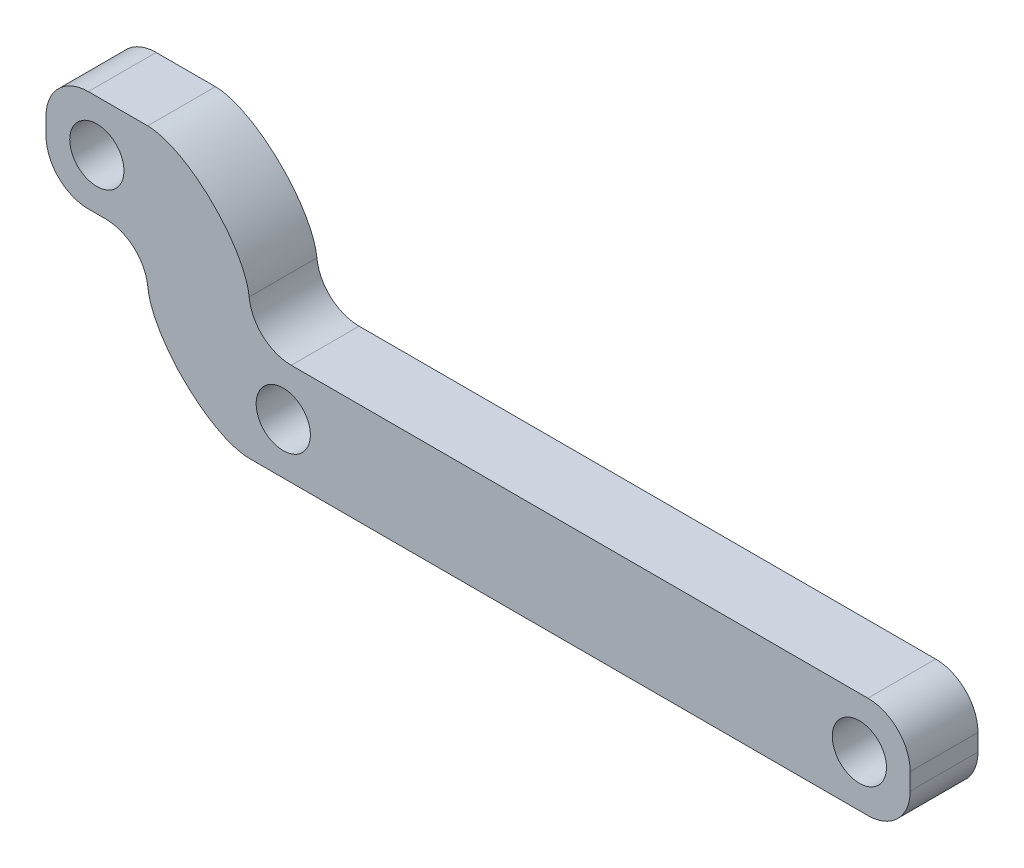
ISO-10303-21;
HEADER;
FILE_DESCRIPTION(('STEP AP214'),'2;1');
FILE_NAME('part.step','',(''),(''),'','','');
FILE_SCHEMA(('AUTOMOTIVE_DESIGN { 1 0 10303 214 1 1 1 1 }'));
ENDSEC;
DATA;
#1=APPLICATION_CONTEXT('core data for automotive mechanical design processes');
#2=APPLICATION_PROTOCOL_DEFINITION('international standard','automotive_design',2000,#1);
#3=PRODUCT_CONTEXT('',#1,'mechanical');
#4=PRODUCT('Part','Part','',(#3));
#5=PRODUCT_RELATED_PRODUCT_CATEGORY('part','',(#4));
#6=PRODUCT_DEFINITION_FORMATION('','',#4);
#7=PRODUCT_DEFINITION_CONTEXT('part definition',#1,'design');
#8=PRODUCT_DEFINITION('design','',#6,#7);
#9=PRODUCT_DEFINITION_SHAPE('','',#8);
#10=(LENGTH_UNIT() NAMED_UNIT(*) SI_UNIT(.MILLI.,.METRE.));
#11=(NAMED_UNIT(*) PLANE_ANGLE_UNIT() SI_UNIT($,.RADIAN.));
#12=(NAMED_UNIT(*) SI_UNIT($,.STERADIAN.) SOLID_ANGLE_UNIT());
#13=UNCERTAINTY_MEASURE_WITH_UNIT(LENGTH_MEASURE(1.E-05),#10,'distance_accuracy_value','');
#14=(GEOMETRIC_REPRESENTATION_CONTEXT(3) GLOBAL_UNCERTAINTY_ASSIGNED_CONTEXT((#13)) GLOBAL_UNIT_ASSIGNED_CONTEXT((#10,
#11,#12)) REPRESENTATION_CONTEXT('',''));
#15=CARTESIAN_POINT('',(0.,0.,0.));
#16=DIRECTION('',(0.,0.,1.));
#17=DIRECTION('',(1.,0.,0.));
#18=AXIS2_PLACEMENT_3D('',#15,#16,#17);
#19=CARTESIAN_POINT('',(0.,0.,4.));
#20=DIRECTION('',(0.,-1.,0.));
#21=DIRECTION('',(1.,0.,0.));
#22=AXIS2_PLACEMENT_3D('',#19,#20,#21);
#23=PLANE('',#22);
#24=DIRECTION('',(-1.,0.,0.));
#25=VECTOR('',#24,1.);
#26=CARTESIAN_POINT('',(0.,0.,0.));
#27=LINE('',#26,#25);
#28=CARTESIAN_POINT('',(-2.5,0.,0.));
#29=VERTEX_POINT('',#28);
#30=CARTESIAN_POINT('',(-36.5257940578732,0.,0.));
#31=VERTEX_POINT('',#30);
#32=EDGE_CURVE('E155',#29,#31,#27,.T.);
#33=ORIENTED_EDGE('',*,*,#32,.T.);
#34=DIRECTION('',(0.,0.,1.));
#35=VECTOR('',#34,1.);
#36=CARTESIAN_POINT('',(-36.5257940578732,0.,4.));
#37=LINE('',#36,#35);
#38=CARTESIAN_POINT('',(-36.5257940578732,0.,4.));
#39=VERTEX_POINT('',#38);
#40=EDGE_CURVE('E57',#31,#39,#37,.T.);
#41=ORIENTED_EDGE('',*,*,#40,.T.);
#42=DIRECTION('',(-1.,0.,0.));
#43=VECTOR('',#42,1.);
#44=CARTESIAN_POINT('',(0.,0.,4.));
#45=LINE('',#44,#43);
#46=CARTESIAN_POINT('',(-2.5,0.,4.));
#47=VERTEX_POINT('',#46);
#48=EDGE_CURVE('E320',#47,#39,#45,.T.);
#49=ORIENTED_EDGE('',*,*,#48,.F.);
#50=DIRECTION('',(0.,0.,-1.));
#51=VECTOR('',#50,1.);
#52=CARTESIAN_POINT('',(-2.5,0.,0.));
#53=LINE('',#52,#51);
#54=EDGE_CURVE('E323',#47,#29,#53,.T.);
#55=ORIENTED_EDGE('',*,*,#54,.T.);
#56=EDGE_LOOP('',(#33,#41,#49,#55));
#57=FACE_BOUND('',#56,.T.);
#58=ADVANCED_FACE('F41',(#57),#23,.F.);
#59=CARTESIAN_POINT('',(0.,7.99999999999999,4.));
#60=DIRECTION('',(0.,1.,0.));
#61=DIRECTION('',(0.,0.,1.));
#62=AXIS2_PLACEMENT_3D('',#59,#60,#61);
#63=PLANE('',#62);
#64=DIRECTION('',(1.,0.,0.));
#65=VECTOR('',#64,1.);
#66=CARTESIAN_POINT('',(0.,7.99999999999999,0.));
#67=LINE('',#66,#65);
#68=CARTESIAN_POINT('',(-48.5,7.99999999999999,0.));
#69=VERTEX_POINT('',#68);
#70=CARTESIAN_POINT('',(-45.,7.99999999999999,0.));
#71=VERTEX_POINT('',#70);
#72=EDGE_CURVE('E144',#69,#71,#67,.T.);
#73=ORIENTED_EDGE('',*,*,#72,.F.);
#74=DIRECTION('',(0.,0.,-1.));
#75=VECTOR('',#74,1.);
#76=CARTESIAN_POINT('',(-48.5,7.99999999999999,4.));
#77=LINE('',#76,#75);
#78=CARTESIAN_POINT('',(-48.5,7.99999999999999,4.));
#79=VERTEX_POINT('',#78);
#80=EDGE_CURVE('E410',#69,#79,#77,.F.);
#81=ORIENTED_EDGE('',*,*,#80,.T.);
#82=DIRECTION('',(1.,0.,0.));
#83=VECTOR('',#82,1.);
#84=CARTESIAN_POINT('',(0.,7.99999999999999,4.));
#85=LINE('',#84,#83);
#86=CARTESIAN_POINT('',(-45.,7.99999999999999,4.));
#87=VERTEX_POINT('',#86);
#88=EDGE_CURVE('E175',#79,#87,#85,.T.);
#89=ORIENTED_EDGE('',*,*,#88,.T.);
#90=CARTESIAN_POINT('',(-45.,7.99999999999999,-0.2));
#91=CARTESIAN_POINT('',(-45.,7.99999999999999,1.26666666666667));
#92=CARTESIAN_POINT('',(-45.,7.99999999999999,2.73333333333333));
#93=CARTESIAN_POINT('',(-45.,7.99999999999999,4.2));
#94=(BOUNDED_CURVE() B_SPLINE_CURVE(3,(#90,#91,#92,#93),.UNSPECIFIED.,.F.,
.F.) B_SPLINE_CURVE_WITH_KNOTS((4,4),(-0.0042,0.0002),
.UNSPECIFIED.) CURVE() GEOMETRIC_REPRESENTATION_ITEM() RATIONAL_B_SPLINE_CURVE((1.,1.,1.,1.)) REPRESENTATION_ITEM(''));
#95=EDGE_CURVE('E163',#87,#71,#94,.F.);
#96=ORIENTED_EDGE('',*,*,#95,.T.);
#97=EDGE_LOOP('',(#73,#81,#89,#96));
#98=FACE_BOUND('',#97,.T.);
#99=ADVANCED_FACE('F173',(#98),#63,.T.);
#100=CARTESIAN_POINT('',(-51.,0.,4.));
#101=DIRECTION('',(1.,0.,0.));
#102=DIRECTION('',(0.,0.,-1.));
#103=AXIS2_PLACEMENT_3D('',#100,#101,#102);
#104=PLANE('',#103);
#105=DIRECTION('',(0.,-1.,0.));
#106=VECTOR('',#105,1.);
#107=CARTESIAN_POINT('',(-51.,0.,4.));
#108=LINE('',#107,#106);
#109=CARTESIAN_POINT('',(-51.,5.49999999999999,4.));
#110=VERTEX_POINT('',#109);
#111=CARTESIAN_POINT('',(-51.,4.49999999999999,4.));
#112=VERTEX_POINT('',#111);
#113=EDGE_CURVE('E405',#110,#112,#108,.T.);
#114=ORIENTED_EDGE('',*,*,#113,.F.);
#115=DIRECTION('',(0.,0.,-1.));
#116=VECTOR('',#115,1.);
#117=CARTESIAN_POINT('',(-51.,5.49999999999999,0.));
#118=LINE('',#117,#116);
#119=CARTESIAN_POINT('',(-51.,5.49999999999999,0.));
#120=VERTEX_POINT('',#119);
#121=EDGE_CURVE('E316',#110,#120,#118,.T.);
#122=ORIENTED_EDGE('',*,*,#121,.T.);
#123=DIRECTION('',(0.,-1.,0.));
#124=VECTOR('',#123,1.);
#125=CARTESIAN_POINT('',(-51.,0.,0.));
#126=LINE('',#125,#124);
#127=CARTESIAN_POINT('',(-51.,4.49999999999999,0.));
#128=VERTEX_POINT('',#127);
#129=EDGE_CURVE('E154',#120,#128,#126,.T.);
#130=ORIENTED_EDGE('',*,*,#129,.T.);
#131=DIRECTION('',(0.,0.,-1.));
#132=VECTOR('',#131,1.);
#133=CARTESIAN_POINT('',(-51.,4.49999999999999,4.));
#134=LINE('',#133,#132);
#135=EDGE_CURVE('E315',#128,#112,#134,.F.);
#136=ORIENTED_EDGE('',*,*,#135,.T.);
#137=EDGE_LOOP('',(#114,#122,#130,#136));
#138=FACE_BOUND('',#137,.T.);
#139=ADVANCED_FACE('F196',(#138),#104,.F.);
#140=CARTESIAN_POINT('',(0.,2.,4.));
#141=DIRECTION('',(0.,-1.,0.));
#142=DIRECTION('',(1.,0.,0.));
#143=AXIS2_PLACEMENT_3D('',#140,#141,#142);
#144=PLANE('',#143);
#145=DIRECTION('',(-1.,0.,0.));
#146=VECTOR('',#145,1.);
#147=CARTESIAN_POINT('',(0.,2.,4.));
#148=LINE('',#147,#146);
#149=CARTESIAN_POINT('',(-47.4742059421268,1.99999999999999,4.));
#150=VERTEX_POINT('',#149);
#151=CARTESIAN_POINT('',(-48.5,1.99999999999999,4.));
#152=VERTEX_POINT('',#151);
#153=EDGE_CURVE('E403',#150,#152,#148,.T.);
#154=ORIENTED_EDGE('',*,*,#153,.T.);
#155=DIRECTION('',(0.,0.,-1.));
#156=VECTOR('',#155,1.);
#157=CARTESIAN_POINT('',(-48.5,1.99999999999999,0.));
#158=LINE('',#157,#156);
#159=CARTESIAN_POINT('',(-48.5,1.99999999999999,0.));
#160=VERTEX_POINT('',#159);
#161=EDGE_CURVE('E329',#152,#160,#158,.T.);
#162=ORIENTED_EDGE('',*,*,#161,.T.);
#163=DIRECTION('',(-1.,0.,0.));
#164=VECTOR('',#163,1.);
#165=CARTESIAN_POINT('',(0.,2.,0.));
#166=LINE('',#165,#164);
#167=CARTESIAN_POINT('',(-47.4742059421268,1.99999999999999,0.));
#168=VERTEX_POINT('',#167);
#169=EDGE_CURVE('E370',#168,#160,#166,.T.);
#170=ORIENTED_EDGE('',*,*,#169,.F.);
#171=DIRECTION('',(0.,0.,-1.));
#172=VECTOR('',#171,1.);
#173=CARTESIAN_POINT('',(-47.4742059421268,1.99999999999999,4.));
#174=LINE('',#173,#172);
#175=EDGE_CURVE('E394',#168,#150,#174,.F.);
#176=ORIENTED_EDGE('',*,*,#175,.T.);
#177=EDGE_LOOP('',(#154,#162,#170,#176));
#178=FACE_BOUND('',#177,.T.);
#179=ADVANCED_FACE('F298',(#178),#144,.T.);
#180=CARTESIAN_POINT('',(0.,-6.,4.));
#181=DIRECTION('',(0.,-1.,0.));
#182=DIRECTION('',(1.,0.,0.));
#183=AXIS2_PLACEMENT_3D('',#180,#181,#182);
#184=PLANE('',#183);
#185=DIRECTION('',(-1.,0.,0.));
#186=VECTOR('',#185,1.);
#187=CARTESIAN_POINT('',(0.,-6.,0.));
#188=LINE('',#187,#186);
#189=CARTESIAN_POINT('',(-2.5,-6.,0.));
#190=VERTEX_POINT('',#189);
#191=CARTESIAN_POINT('',(-39.,-6.,0.));
#192=VERTEX_POINT('',#191);
#193=EDGE_CURVE('E310',#190,#192,#188,.T.);
#194=ORIENTED_EDGE('',*,*,#193,.F.);
#195=DIRECTION('',(0.,0.,-1.));
#196=VECTOR('',#195,1.);
#197=CARTESIAN_POINT('',(-2.5,-6.,4.));
#198=LINE('',#197,#196);
#199=CARTESIAN_POINT('',(-2.5,-6.,4.));
#200=VERTEX_POINT('',#199);
#201=EDGE_CURVE('E342',#190,#200,#198,.F.);
#202=ORIENTED_EDGE('',*,*,#201,.T.);
#203=DIRECTION('',(-1.,0.,0.));
#204=VECTOR('',#203,1.);
#205=CARTESIAN_POINT('',(0.,-6.,4.));
#206=LINE('',#205,#204);
#207=CARTESIAN_POINT('',(-39.,-6.,4.));
#208=VERTEX_POINT('',#207);
#209=EDGE_CURVE('E312',#200,#208,#206,.T.);
#210=ORIENTED_EDGE('',*,*,#209,.T.);
#211=CARTESIAN_POINT('',(-39.,-6.,-0.2));
#212=CARTESIAN_POINT('',(-39.,-6.,1.26666666666667));
#213=CARTESIAN_POINT('',(-39.,-6.,2.73333333333333));
#214=CARTESIAN_POINT('',(-39.,-6.,4.2));
#215=(BOUNDED_CURVE() B_SPLINE_CURVE(3,(#211,#212,#213,#214),.UNSPECIFIED.,.F.,
.F.) B_SPLINE_CURVE_WITH_KNOTS((4,4),(-0.0042,0.0002),
.UNSPECIFIED.) CURVE() GEOMETRIC_REPRESENTATION_ITEM() RATIONAL_B_SPLINE_CURVE((1.,1.,1.,1.)) REPRESENTATION_ITEM(''));
#216=EDGE_CURVE('E309',#208,#192,#215,.F.);
#217=ORIENTED_EDGE('',*,*,#216,.T.);
#218=EDGE_LOOP('',(#194,#202,#210,#217));
#219=FACE_BOUND('',#218,.T.);
#220=ADVANCED_FACE('F294',(#219),#184,.T.);
#221=CARTESIAN_POINT('',(0.,0.,4.));
#222=DIRECTION('',(1.,0.,0.));
#223=DIRECTION('',(0.,0.,-1.));
#224=AXIS2_PLACEMENT_3D('',#221,#222,#223);
#225=PLANE('',#224);
#226=DIRECTION('',(0.,-1.,0.));
#227=VECTOR('',#226,1.);
#228=CARTESIAN_POINT('',(0.,0.,0.));
#229=LINE('',#228,#227);
#230=CARTESIAN_POINT('',(0.,-2.5,0.));
#231=VERTEX_POINT('',#230);
#232=CARTESIAN_POINT('',(0.,-3.5,0.));
#233=VERTEX_POINT('',#232);
#234=EDGE_CURVE('E179',#231,#233,#229,.T.);
#235=ORIENTED_EDGE('',*,*,#234,.F.);
#236=DIRECTION('',(0.,0.,-1.));
#237=VECTOR('',#236,1.);
#238=CARTESIAN_POINT('',(0.,-2.5,4.));
#239=LINE('',#238,#237);
#240=CARTESIAN_POINT('',(0.,-2.5,4.));
#241=VERTEX_POINT('',#240);
#242=EDGE_CURVE('E340',#231,#241,#239,.F.);
#243=ORIENTED_EDGE('',*,*,#242,.T.);
#244=DIRECTION('',(0.,-1.,0.));
#245=VECTOR('',#244,1.);
#246=CARTESIAN_POINT('',(0.,0.,4.));
#247=LINE('',#246,#245);
#248=CARTESIAN_POINT('',(0.,-3.5,4.));
#249=VERTEX_POINT('',#248);
#250=EDGE_CURVE('E176',#241,#249,#247,.T.);
#251=ORIENTED_EDGE('',*,*,#250,.T.);
#252=DIRECTION('',(0.,0.,-1.));
#253=VECTOR('',#252,1.);
#254=CARTESIAN_POINT('',(0.,-3.5,4.));
#255=LINE('',#254,#253);
#256=EDGE_CURVE('E337',#249,#233,#255,.T.);
#257=ORIENTED_EDGE('',*,*,#256,.T.);
#258=EDGE_LOOP('',(#235,#243,#251,#257));
#259=FACE_BOUND('',#258,.T.);
#260=ADVANCED_FACE('F275',(#259),#225,.T.);
#261=CARTESIAN_POINT('',(0.,0.,4.));
#262=DIRECTION('',(0.,0.,1.));
#263=DIRECTION('',(1.,0.,0.));
#264=AXIS2_PLACEMENT_3D('',#261,#262,#263);
#265=PLANE('',#264);
#266=CARTESIAN_POINT('',(-37.,-3.,4.));
#267=DIRECTION('',(0.,0.,-1.));
#268=DIRECTION('',(-1.,0.,0.));
#269=AXIS2_PLACEMENT_3D('',#266,#267,#268);
#270=CIRCLE('',#269,1.6);
#271=CARTESIAN_POINT('',(-38.6,-3.,4.));
#272=VERTEX_POINT('',#271);
#273=EDGE_CURVE('E420',#272,#272,#270,.T.);
#274=ORIENTED_EDGE('',*,*,#273,.T.);
#275=EDGE_LOOP('',(#274));
#276=FACE_BOUND('',#275,.T.);
#277=CARTESIAN_POINT('',(-48.,4.99999999999999,4.));
#278=DIRECTION('',(0.,0.,-1.));
#279=DIRECTION('',(-1.,0.,0.));
#280=AXIS2_PLACEMENT_3D('',#277,#278,#279);
#281=CIRCLE('',#280,1.6);
#282=CARTESIAN_POINT('',(-49.6,4.99999999999999,4.));
#283=VERTEX_POINT('',#282);
#284=EDGE_CURVE('E425',#283,#283,#281,.T.);
#285=ORIENTED_EDGE('',*,*,#284,.T.);
#286=EDGE_LOOP('',(#285));
#287=FACE_BOUND('',#286,.T.);
#288=CARTESIAN_POINT('',(-3.,-3.,4.));
#289=DIRECTION('',(0.,0.,-1.));
#290=DIRECTION('',(-1.,0.,0.));
#291=AXIS2_PLACEMENT_3D('',#288,#289,#290);
#292=CIRCLE('',#291,1.6);
#293=CARTESIAN_POINT('',(-4.6,-3.,4.));
#294=VERTEX_POINT('',#293);
#295=EDGE_CURVE('E356',#294,#294,#292,.T.);
#296=ORIENTED_EDGE('',*,*,#295,.T.);
#297=EDGE_LOOP('',(#296));
#298=FACE_BOUND('',#297,.T.);
#299=ORIENTED_EDGE('',*,*,#88,.F.);
#300=CARTESIAN_POINT('',(-48.5,5.49999999999999,4.));
#301=DIRECTION('',(0.,0.,1.));
#302=DIRECTION('',(1.,0.,0.));
#303=AXIS2_PLACEMENT_3D('',#300,#301,#302);
#304=CIRCLE('',#303,2.5);
#305=EDGE_CURVE('E392',#79,#110,#304,.T.);
#306=ORIENTED_EDGE('',*,*,#305,.T.);
#307=ORIENTED_EDGE('',*,*,#113,.T.);
#308=CARTESIAN_POINT('',(-48.5,4.49999999999999,4.));
#309=DIRECTION('',(0.,0.,1.));
#310=DIRECTION('',(1.,0.,0.));
#311=AXIS2_PLACEMENT_3D('',#308,#309,#310);
#312=CIRCLE('',#311,2.5);
#313=EDGE_CURVE('E389',#112,#152,#312,.T.);
#314=ORIENTED_EDGE('',*,*,#313,.T.);
#315=ORIENTED_EDGE('',*,*,#153,.F.);
#316=CARTESIAN_POINT('',(-47.4742059421268,-0.500000000000016,4.));
#317=DIRECTION('',(0.,0.,1.));
#318=DIRECTION('',(1.,0.,0.));
#319=AXIS2_PLACEMENT_3D('',#316,#317,#318);
#320=CIRCLE('',#319,2.5);
#321=CARTESIAN_POINT('',(-44.9871427333092,-0.246999308411161,4.));
#322=VERTEX_POINT('',#321);
#323=EDGE_CURVE('E346',#150,#322,#320,.F.);
#324=ORIENTED_EDGE('',*,*,#323,.T.);
#325=CARTESIAN_POINT('',(-39.,-6.,4.));
#326=CARTESIAN_POINT('',(-45.,-6.,4.));
#327=CARTESIAN_POINT('',(-45.,0.,4.));
#328=(BOUNDED_CURVE() B_SPLINE_CURVE(2,(#325,#326,#327),.UNSPECIFIED.,.F.,
.F.) B_SPLINE_CURVE_WITH_KNOTS((3,3),(0.,1.),
.UNSPECIFIED.) CURVE() GEOMETRIC_REPRESENTATION_ITEM() RATIONAL_B_SPLINE_CURVE((1.,
0.428571428571429,1.)) REPRESENTATION_ITEM(''));
#329=EDGE_CURVE('E167',#322,#208,#328,.F.);
#330=ORIENTED_EDGE('',*,*,#329,.T.);
#331=ORIENTED_EDGE('',*,*,#209,.F.);
#332=CARTESIAN_POINT('',(-2.5,-3.5,4.));
#333=DIRECTION('',(0.,0.,1.));
#334=DIRECTION('',(1.,0.,0.));
#335=AXIS2_PLACEMENT_3D('',#332,#333,#334);
#336=CIRCLE('',#335,2.5);
#337=EDGE_CURVE('E396',#200,#249,#336,.T.);
#338=ORIENTED_EDGE('',*,*,#337,.T.);
#339=ORIENTED_EDGE('',*,*,#250,.F.);
#340=CARTESIAN_POINT('',(-2.5,-2.5,4.));
#341=DIRECTION('',(0.,0.,1.));
#342=DIRECTION('',(1.,0.,0.));
#343=AXIS2_PLACEMENT_3D('',#340,#341,#342);
#344=CIRCLE('',#343,2.5);
#345=EDGE_CURVE('E64',#241,#47,#344,.T.);
#346=ORIENTED_EDGE('',*,*,#345,.T.);
#347=ORIENTED_EDGE('',*,*,#48,.T.);
#348=CARTESIAN_POINT('',(-36.5257940578732,2.49999999999999,4.));
#349=DIRECTION('',(0.,0.,1.));
#350=DIRECTION('',(1.,0.,0.));
#351=AXIS2_PLACEMENT_3D('',#348,#349,#350);
#352=CIRCLE('',#351,2.5);
#353=CARTESIAN_POINT('',(-39.0128572666905,2.24699930841117,4.));
#354=VERTEX_POINT('',#353);
#355=EDGE_CURVE('E12',#39,#354,#352,.F.);
#356=ORIENTED_EDGE('',*,*,#355,.T.);
#357=CARTESIAN_POINT('',(-45.,7.99999999999999,4.));
#358=CARTESIAN_POINT('',(-39.,7.99999999999999,4.));
#359=CARTESIAN_POINT('',(-39.,1.99999999999999,4.));
#360=(BOUNDED_CURVE() B_SPLINE_CURVE(2,(#357,#358,#359),.UNSPECIFIED.,.F.,
.F.) B_SPLINE_CURVE_WITH_KNOTS((3,3),(0.,1.),
.UNSPECIFIED.) CURVE() GEOMETRIC_REPRESENTATION_ITEM() RATIONAL_B_SPLINE_CURVE((1.,
0.428571428571429,1.)) REPRESENTATION_ITEM(''));
#361=EDGE_CURVE('E245',#354,#87,#360,.F.);
#362=ORIENTED_EDGE('',*,*,#361,.T.);
#363=EDGE_LOOP('',(#299,#306,#307,#314,#315,#324,#330,#331,#338,#339,#346,#347,#356,#362));
#364=FACE_BOUND('',#363,.T.);
#365=ADVANCED_FACE('F266',(#276,#287,#298,#364),#265,.T.);
#366=CARTESIAN_POINT('',(0.,0.,0.));
#367=DIRECTION('',(0.,0.,1.));
#368=DIRECTION('',(1.,0.,0.));
#369=AXIS2_PLACEMENT_3D('',#366,#367,#368);
#370=PLANE('',#369);
#371=CARTESIAN_POINT('',(-37.,-3.,0.));
#372=DIRECTION('',(0.,0.,-1.));
#373=DIRECTION('',(-1.,0.,0.));
#374=AXIS2_PLACEMENT_3D('',#371,#372,#373);
#375=CIRCLE('',#374,1.6);
#376=CARTESIAN_POINT('',(-38.6,-3.,0.));
#377=VERTEX_POINT('',#376);
#378=EDGE_CURVE('E428',#377,#377,#375,.T.);
#379=ORIENTED_EDGE('',*,*,#378,.F.);
#380=EDGE_LOOP('',(#379));
#381=FACE_BOUND('',#380,.T.);
#382=CARTESIAN_POINT('',(-48.,4.99999999999999,0.));
#383=DIRECTION('',(0.,0.,-1.));
#384=DIRECTION('',(-1.,0.,0.));
#385=AXIS2_PLACEMENT_3D('',#382,#383,#384);
#386=CIRCLE('',#385,1.6);
#387=CARTESIAN_POINT('',(-49.6,4.99999999999999,0.));
#388=VERTEX_POINT('',#387);
#389=EDGE_CURVE('E422',#388,#388,#386,.T.);
#390=ORIENTED_EDGE('',*,*,#389,.F.);
#391=EDGE_LOOP('',(#390));
#392=FACE_BOUND('',#391,.T.);
#393=CARTESIAN_POINT('',(-3.,-3.,0.));
#394=DIRECTION('',(0.,0.,-1.));
#395=DIRECTION('',(-1.,0.,0.));
#396=AXIS2_PLACEMENT_3D('',#393,#394,#395);
#397=CIRCLE('',#396,1.6);
#398=CARTESIAN_POINT('',(-4.6,-3.,0.));
#399=VERTEX_POINT('',#398);
#400=EDGE_CURVE('E359',#399,#399,#397,.T.);
#401=ORIENTED_EDGE('',*,*,#400,.F.);
#402=EDGE_LOOP('',(#401));
#403=FACE_BOUND('',#402,.T.);
#404=ORIENTED_EDGE('',*,*,#129,.F.);
#405=CARTESIAN_POINT('',(-48.5,5.49999999999999,0.));
#406=DIRECTION('',(0.,0.,1.));
#407=DIRECTION('',(1.,0.,0.));
#408=AXIS2_PLACEMENT_3D('',#405,#406,#407);
#409=CIRCLE('',#408,2.5);
#410=EDGE_CURVE('E150',#120,#69,#409,.F.);
#411=ORIENTED_EDGE('',*,*,#410,.T.);
#412=ORIENTED_EDGE('',*,*,#72,.T.);
#413=CARTESIAN_POINT('',(-39.,1.99999999999999,0.));
#414=CARTESIAN_POINT('',(-39.,7.99999999999999,0.));
#415=CARTESIAN_POINT('',(-45.,7.99999999999999,0.));
#416=(BOUNDED_CURVE() B_SPLINE_CURVE(2,(#413,#414,#415),.UNSPECIFIED.,.F.,
.F.) B_SPLINE_CURVE_WITH_KNOTS((3,3),(0.,1.),
.UNSPECIFIED.) CURVE() GEOMETRIC_REPRESENTATION_ITEM() RATIONAL_B_SPLINE_CURVE((1.,
0.428571428571428,1.)) REPRESENTATION_ITEM(''));
#417=CARTESIAN_POINT('',(-39.0128486775161,2.24700014004863,0.));
#418=VERTEX_POINT('',#417);
#419=EDGE_CURVE('E148',#71,#418,#416,.F.);
#420=ORIENTED_EDGE('',*,*,#419,.T.);
#421=CARTESIAN_POINT('',(-36.5257940578732,2.49999999999999,0.));
#422=DIRECTION('',(0.,0.,1.));
#423=DIRECTION('',(1.,0.,0.));
#424=AXIS2_PLACEMENT_3D('',#421,#422,#423);
#425=CIRCLE('',#424,2.5);
#426=EDGE_CURVE('E50',#418,#31,#425,.T.);
#427=ORIENTED_EDGE('',*,*,#426,.T.);
#428=ORIENTED_EDGE('',*,*,#32,.F.);
#429=CARTESIAN_POINT('',(-2.5,-2.5,0.));
#430=DIRECTION('',(0.,0.,1.));
#431=DIRECTION('',(1.,0.,0.));
#432=AXIS2_PLACEMENT_3D('',#429,#430,#431);
#433=CIRCLE('',#432,2.5);
#434=EDGE_CURVE('E608',#29,#231,#433,.F.);
#435=ORIENTED_EDGE('',*,*,#434,.T.);
#436=ORIENTED_EDGE('',*,*,#234,.T.);
#437=CARTESIAN_POINT('',(-2.5,-3.5,0.));
#438=DIRECTION('',(0.,0.,1.));
#439=DIRECTION('',(1.,0.,0.));
#440=AXIS2_PLACEMENT_3D('',#437,#438,#439);
#441=CIRCLE('',#440,2.5);
#442=EDGE_CURVE('E371',#233,#190,#441,.F.);
#443=ORIENTED_EDGE('',*,*,#442,.T.);
#444=ORIENTED_EDGE('',*,*,#193,.T.);
#445=CARTESIAN_POINT('',(-45.,0.,0.));
#446=CARTESIAN_POINT('',(-45.,-6.00000000000001,0.));
#447=CARTESIAN_POINT('',(-39.,-6.,0.));
#448=(BOUNDED_CURVE() B_SPLINE_CURVE(2,(#445,#446,#447),.UNSPECIFIED.,.F.,
.F.) B_SPLINE_CURVE_WITH_KNOTS((3,3),(0.,1.),
.UNSPECIFIED.) CURVE() GEOMETRIC_REPRESENTATION_ITEM() RATIONAL_B_SPLINE_CURVE((1.,
0.428571428571428,1.)) REPRESENTATION_ITEM(''));
#449=CARTESIAN_POINT('',(-44.9871513224833,-0.247000140048601,0.));
#450=VERTEX_POINT('',#449);
#451=EDGE_CURVE('E168',#192,#450,#448,.F.);
#452=ORIENTED_EDGE('',*,*,#451,.T.);
#453=CARTESIAN_POINT('',(-47.4742059421268,-0.500000000000016,0.));
#454=DIRECTION('',(0.,0.,1.));
#455=DIRECTION('',(1.,0.,0.));
#456=AXIS2_PLACEMENT_3D('',#453,#454,#455);
#457=CIRCLE('',#456,2.5);
#458=EDGE_CURVE('E344',#450,#168,#457,.T.);
#459=ORIENTED_EDGE('',*,*,#458,.T.);
#460=ORIENTED_EDGE('',*,*,#169,.T.);
#461=CARTESIAN_POINT('',(-48.5,4.49999999999999,0.));
#462=DIRECTION('',(0.,0.,1.));
#463=DIRECTION('',(1.,0.,0.));
#464=AXIS2_PLACEMENT_3D('',#461,#462,#463);
#465=CIRCLE('',#464,2.5);
#466=EDGE_CURVE('E387',#160,#128,#465,.F.);
#467=ORIENTED_EDGE('',*,*,#466,.T.);
#468=EDGE_LOOP('',(#404,#411,#412,#420,#427,#428,#435,#436,#443,#444,#452,#459,#460,#467));
#469=FACE_BOUND('',#468,.T.);
#470=ADVANCED_FACE('F147',(#381,#392,#403,#469),#370,.F.);
#471=CARTESIAN_POINT('',(-3.,-3.,4.));
#472=DIRECTION('',(0.,0.,-1.));
#473=DIRECTION('',(-1.,0.,0.));
#474=AXIS2_PLACEMENT_3D('',#471,#472,#473);
#475=CYLINDRICAL_SURFACE('',#474,1.6);
#476=ORIENTED_EDGE('',*,*,#295,.F.);
#477=EDGE_LOOP('',(#476));
#478=FACE_BOUND('',#477,.T.);
#479=ORIENTED_EDGE('',*,*,#400,.T.);
#480=EDGE_LOOP('',(#479));
#481=FACE_BOUND('',#480,.T.);
#482=ADVANCED_FACE('F277',(#478,#481),#475,.F.);
#483=CARTESIAN_POINT('',(-48.,4.99999999999999,4.));
#484=DIRECTION('',(0.,0.,-1.));
#485=DIRECTION('',(-1.,0.,0.));
#486=AXIS2_PLACEMENT_3D('',#483,#484,#485);
#487=CYLINDRICAL_SURFACE('',#486,1.6);
#488=ORIENTED_EDGE('',*,*,#284,.F.);
#489=EDGE_LOOP('',(#488));
#490=FACE_BOUND('',#489,.T.);
#491=ORIENTED_EDGE('',*,*,#389,.T.);
#492=EDGE_LOOP('',(#491));
#493=FACE_BOUND('',#492,.T.);
#494=ADVANCED_FACE('F437',(#490,#493),#487,.F.);
#495=CARTESIAN_POINT('',(-37.,-3.,4.));
#496=DIRECTION('',(0.,0.,-1.));
#497=DIRECTION('',(-1.,0.,0.));
#498=AXIS2_PLACEMENT_3D('',#495,#496,#497);
#499=CYLINDRICAL_SURFACE('',#498,1.6);
#500=ORIENTED_EDGE('',*,*,#273,.F.);
#501=EDGE_LOOP('',(#500));
#502=FACE_BOUND('',#501,.T.);
#503=ORIENTED_EDGE('',*,*,#378,.T.);
#504=EDGE_LOOP('',(#503));
#505=FACE_BOUND('',#504,.T.);
#506=ADVANCED_FACE('F209',(#502,#505),#499,.F.);
#507=CARTESIAN_POINT('',(-39.,1.99999999999999,-0.2));
#508=CARTESIAN_POINT('',(-39.,1.99999999999999,1.26666666666667));
#509=CARTESIAN_POINT('',(-39.,1.99999999999999,2.73333333333333));
#510=CARTESIAN_POINT('',(-39.,1.99999999999999,4.2));
#511=CARTESIAN_POINT('',(-39.,7.99999999999999,-0.2));
#512=CARTESIAN_POINT('',(-39.,7.99999999999999,1.26666666666667));
#513=CARTESIAN_POINT('',(-39.,7.99999999999999,2.73333333333333));
#514=CARTESIAN_POINT('',(-39.,7.99999999999999,4.2));
#515=CARTESIAN_POINT('',(-45.,7.99999999999999,-0.2));
#516=CARTESIAN_POINT('',(-45.,7.99999999999999,1.26666666666667));
#517=CARTESIAN_POINT('',(-45.,7.99999999999999,2.73333333333333));
#518=CARTESIAN_POINT('',(-45.,7.99999999999999,4.2));
#519=(BOUNDED_SURFACE() B_SPLINE_SURFACE(2,3,((#507,#508,#509,#510),(#511,#512,#513,#514),(#515,
#516,#517,#518)),.UNSPECIFIED.,.F.,.F.,.F.) B_SPLINE_SURFACE_WITH_KNOTS((3,3),(4,4),(0.,1.),
(-0.0042,0.0002),.UNSPECIFIED.) GEOMETRIC_REPRESENTATION_ITEM() RATIONAL_B_SPLINE_SURFACE(((1.,
1.,1.,1.),(0.428571428571429,0.428571428571429,0.428571428571429,0.428571428571429),(1.,1.,1.,1.))) REPRESENTATION_ITEM('') SURFACE());
#520=DIRECTION('',(0.,0.,1.));
#521=VECTOR('',#520,1.);
#522=CARTESIAN_POINT('',(-39.0129582173361,2.24698924156599,4.));
#523=LINE('',#522,#521);
#524=EDGE_CURVE('E166',#354,#418,#523,.F.);
#525=ORIENTED_EDGE('',*,*,#361,.F.);
#526=ORIENTED_EDGE('',*,*,#524,.T.);
#527=ORIENTED_EDGE('',*,*,#419,.F.);
#528=ORIENTED_EDGE('',*,*,#95,.F.);
#529=EDGE_LOOP('',(#525,#526,#527,#528));
#530=FACE_BOUND('',#529,.T.);
#531=ADVANCED_FACE('F162',(#530),#519,.T.);
#532=CARTESIAN_POINT('',(-45.,0.,-0.2));
#533=CARTESIAN_POINT('',(-45.,0.,1.26666666666667));
#534=CARTESIAN_POINT('',(-45.,0.,2.73333333333333));
#535=CARTESIAN_POINT('',(-45.,0.,4.2));
#536=CARTESIAN_POINT('',(-45.,-6.,-0.2));
#537=CARTESIAN_POINT('',(-45.,-6.,1.26666666666667));
#538=CARTESIAN_POINT('',(-45.,-6.,2.73333333333333));
#539=CARTESIAN_POINT('',(-45.,-6.,4.2));
#540=CARTESIAN_POINT('',(-39.,-6.,-0.2));
#541=CARTESIAN_POINT('',(-39.,-6.,1.26666666666667));
#542=CARTESIAN_POINT('',(-39.,-6.,2.73333333333333));
#543=CARTESIAN_POINT('',(-39.,-6.,4.2));
#544=(BOUNDED_SURFACE() B_SPLINE_SURFACE(2,3,((#532,#533,#534,#535),(#536,#537,#538,#539),(#540,
#541,#542,#543)),.UNSPECIFIED.,.F.,.F.,.F.) B_SPLINE_SURFACE_WITH_KNOTS((3,3),(4,4),(0.,1.),
(-0.0042,0.0002),.UNSPECIFIED.) GEOMETRIC_REPRESENTATION_ITEM() RATIONAL_B_SPLINE_SURFACE(((1.,
1.,1.,1.),(0.428571428571429,0.428571428571429,0.428571428571429,0.428571428571429),(1.,1.,1.,1.))) REPRESENTATION_ITEM('') SURFACE());
#545=DIRECTION('',(0.,0.,1.));
#546=VECTOR('',#545,1.);
#547=CARTESIAN_POINT('',(-44.9870417826639,-0.246989241566014,4.));
#548=LINE('',#547,#546);
#549=EDGE_CURVE('E324',#322,#450,#548,.F.);
#550=ORIENTED_EDGE('',*,*,#329,.F.);
#551=ORIENTED_EDGE('',*,*,#549,.T.);
#552=ORIENTED_EDGE('',*,*,#451,.F.);
#553=ORIENTED_EDGE('',*,*,#216,.F.);
#554=EDGE_LOOP('',(#550,#551,#552,#553));
#555=FACE_BOUND('',#554,.T.);
#556=ADVANCED_FACE('F208',(#555),#544,.T.);
#557=CARTESIAN_POINT('',(-48.5,5.49999999999999,4.));
#558=DIRECTION('',(0.,0.,1.));
#559=DIRECTION('',(1.,0.,0.));
#560=AXIS2_PLACEMENT_3D('',#557,#558,#559);
#561=CYLINDRICAL_SURFACE('',#560,2.5);
#562=ORIENTED_EDGE('',*,*,#305,.F.);
#563=ORIENTED_EDGE('',*,*,#80,.F.);
#564=ORIENTED_EDGE('',*,*,#410,.F.);
#565=ORIENTED_EDGE('',*,*,#121,.F.);
#566=EDGE_LOOP('',(#562,#563,#564,#565));
#567=FACE_BOUND('',#566,.T.);
#568=ADVANCED_FACE('F473',(#567),#561,.T.);
#569=CARTESIAN_POINT('',(-48.5,4.49999999999999,4.));
#570=DIRECTION('',(0.,0.,1.));
#571=DIRECTION('',(1.,0.,0.));
#572=AXIS2_PLACEMENT_3D('',#569,#570,#571);
#573=CYLINDRICAL_SURFACE('',#572,2.5);
#574=ORIENTED_EDGE('',*,*,#313,.F.);
#575=ORIENTED_EDGE('',*,*,#135,.F.);
#576=ORIENTED_EDGE('',*,*,#466,.F.);
#577=ORIENTED_EDGE('',*,*,#161,.F.);
#578=EDGE_LOOP('',(#574,#575,#576,#577));
#579=FACE_BOUND('',#578,.T.);
#580=ADVANCED_FACE('F385',(#579),#573,.T.);
#581=CARTESIAN_POINT('',(-47.4742059421268,-0.500000000000016,2.));
#582=DIRECTION('',(0.,0.,1.));
#583=DIRECTION('',(1.,0.,0.));
#584=AXIS2_PLACEMENT_3D('',#581,#582,#583);
#585=CYLINDRICAL_SURFACE('',#584,2.5);
#586=ORIENTED_EDGE('',*,*,#323,.F.);
#587=ORIENTED_EDGE('',*,*,#175,.F.);
#588=ORIENTED_EDGE('',*,*,#458,.F.);
#589=ORIENTED_EDGE('',*,*,#549,.F.);
#590=EDGE_LOOP('',(#586,#587,#588,#589));
#591=FACE_BOUND('',#590,.T.);
#592=ADVANCED_FACE('F485',(#591),#585,.F.);
#593=CARTESIAN_POINT('',(-36.5257940578732,2.49999999999999,2.));
#594=DIRECTION('',(0.,0.,1.));
#595=DIRECTION('',(1.,0.,0.));
#596=AXIS2_PLACEMENT_3D('',#593,#594,#595);
#597=CYLINDRICAL_SURFACE('',#596,2.5);
#598=ORIENTED_EDGE('',*,*,#355,.F.);
#599=ORIENTED_EDGE('',*,*,#40,.F.);
#600=ORIENTED_EDGE('',*,*,#426,.F.);
#601=ORIENTED_EDGE('',*,*,#524,.F.);
#602=EDGE_LOOP('',(#598,#599,#600,#601));
#603=FACE_BOUND('',#602,.T.);
#604=ADVANCED_FACE('F322',(#603),#597,.F.);
#605=CARTESIAN_POINT('',(-2.5,-2.5,4.));
#606=DIRECTION('',(0.,0.,1.));
#607=DIRECTION('',(1.,0.,0.));
#608=AXIS2_PLACEMENT_3D('',#605,#606,#607);
#609=CYLINDRICAL_SURFACE('',#608,2.5);
#610=ORIENTED_EDGE('',*,*,#345,.F.);
#611=ORIENTED_EDGE('',*,*,#242,.F.);
#612=ORIENTED_EDGE('',*,*,#434,.F.);
#613=ORIENTED_EDGE('',*,*,#54,.F.);
#614=EDGE_LOOP('',(#610,#611,#612,#613));
#615=FACE_BOUND('',#614,.T.);
#616=ADVANCED_FACE('F499',(#615),#609,.T.);
#617=CARTESIAN_POINT('',(-2.5,-3.5,4.));
#618=DIRECTION('',(0.,0.,-1.));
#619=DIRECTION('',(-1.,0.,0.));
#620=AXIS2_PLACEMENT_3D('',#617,#618,#619);
#621=CYLINDRICAL_SURFACE('',#620,2.5);
#622=ORIENTED_EDGE('',*,*,#337,.F.);
#623=ORIENTED_EDGE('',*,*,#201,.F.);
#624=ORIENTED_EDGE('',*,*,#442,.F.);
#625=ORIENTED_EDGE('',*,*,#256,.F.);
#626=EDGE_LOOP('',(#622,#623,#624,#625));
#627=FACE_BOUND('',#626,.T.);
#628=ADVANCED_FACE('F43',(#627),#621,.T.);
#629=CLOSED_SHELL('',(#58,#99,#139,#179,#220,#260,#365,#470,#482,#494,#506,#531,#556,#568,#580,
#592,#604,#616,#628));
#630=MANIFOLD_SOLID_BREP('B2',#629);
#631=ADVANCED_BREP_SHAPE_REPRESENTATION('',(#18,#630),#14);
#632=SHAPE_DEFINITION_REPRESENTATION(#9,#631);
ENDSEC;
END-ISO-10303-21;
